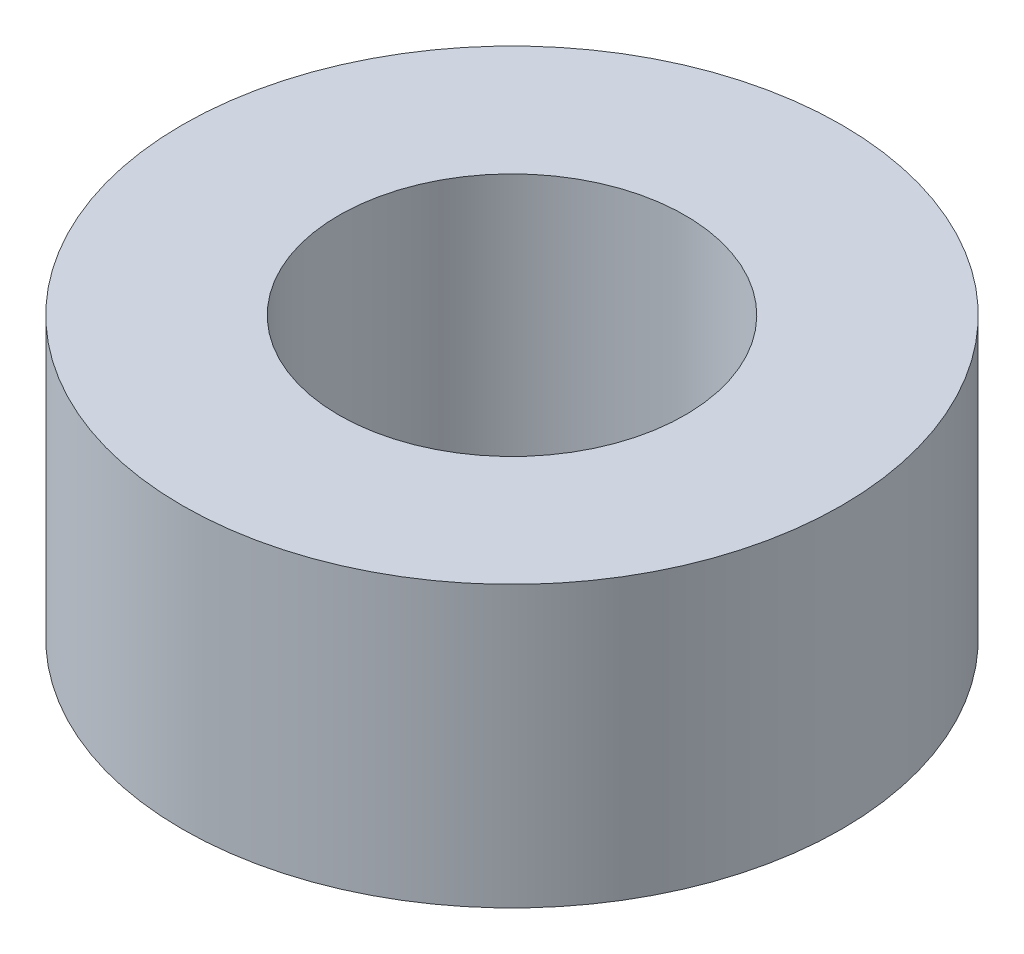
ISO-10303-21;
HEADER;
FILE_DESCRIPTION(('STEP AP214'),'2;1');
FILE_NAME('part.step','',(''),(''),'','','');
FILE_SCHEMA(('AUTOMOTIVE_DESIGN { 1 0 10303 214 1 1 1 1 }'));
ENDSEC;
DATA;
#1=APPLICATION_CONTEXT('core data for automotive mechanical design processes');
#2=APPLICATION_PROTOCOL_DEFINITION('international standard','automotive_design',2000,#1);
#3=PRODUCT_CONTEXT('',#1,'mechanical');
#4=PRODUCT('Part','Part','',(#3));
#5=PRODUCT_RELATED_PRODUCT_CATEGORY('part','',(#4));
#6=PRODUCT_DEFINITION_FORMATION('','',#4);
#7=PRODUCT_DEFINITION_CONTEXT('part definition',#1,'design');
#8=PRODUCT_DEFINITION('design','',#6,#7);
#9=PRODUCT_DEFINITION_SHAPE('','',#8);
#10=(LENGTH_UNIT() NAMED_UNIT(*) SI_UNIT(.MILLI.,.METRE.));
#11=(NAMED_UNIT(*) PLANE_ANGLE_UNIT() SI_UNIT($,.RADIAN.));
#12=(NAMED_UNIT(*) SI_UNIT($,.STERADIAN.) SOLID_ANGLE_UNIT());
#13=UNCERTAINTY_MEASURE_WITH_UNIT(LENGTH_MEASURE(1.E-05),#10,'distance_accuracy_value','');
#14=(GEOMETRIC_REPRESENTATION_CONTEXT(3) GLOBAL_UNCERTAINTY_ASSIGNED_CONTEXT((#13)) GLOBAL_UNIT_ASSIGNED_CONTEXT((#10,
#11,#12)) REPRESENTATION_CONTEXT('',''));
#15=CARTESIAN_POINT('',(0.,0.,0.));
#16=DIRECTION('',(0.,0.,1.));
#17=DIRECTION('',(1.,0.,0.));
#18=AXIS2_PLACEMENT_3D('',#15,#16,#17);
#19=CARTESIAN_POINT('',(0.,10.795,0.));
#20=DIRECTION('',(0.,-1.,0.));
#21=DIRECTION('',(0.,0.,-1.));
#22=AXIS2_PLACEMENT_3D('',#19,#20,#21);
#23=CYLINDRICAL_SURFACE('',#22,12.7);
#24=CARTESIAN_POINT('',(0.,10.795,0.));
#25=DIRECTION('',(0.,1.,0.));
#26=DIRECTION('',(0.,0.,1.));
#27=AXIS2_PLACEMENT_3D('',#24,#25,#26);
#28=CIRCLE('',#27,12.7);
#29=CARTESIAN_POINT('',(0.,10.795,12.7));
#30=VERTEX_POINT('',#29);
#31=EDGE_CURVE('E10',#30,#30,#28,.T.);
#32=ORIENTED_EDGE('',*,*,#31,.F.);
#33=EDGE_LOOP('',(#32));
#34=FACE_BOUND('',#33,.T.);
#35=CARTESIAN_POINT('',(0.,0.,0.));
#36=DIRECTION('',(0.,1.,0.));
#37=DIRECTION('',(0.,0.,1.));
#38=AXIS2_PLACEMENT_3D('',#35,#36,#37);
#39=CIRCLE('',#38,12.7);
#40=CARTESIAN_POINT('',(0.,0.,12.7));
#41=VERTEX_POINT('',#40);
#42=EDGE_CURVE('E34',#41,#41,#39,.T.);
#43=ORIENTED_EDGE('',*,*,#42,.T.);
#44=EDGE_LOOP('',(#43));
#45=FACE_BOUND('',#44,.T.);
#46=ADVANCED_FACE('F31',(#34,#45),#23,.T.);
#47=CARTESIAN_POINT('',(0.,10.795,0.));
#48=DIRECTION('',(0.,1.,0.));
#49=DIRECTION('',(0.,0.,1.));
#50=AXIS2_PLACEMENT_3D('',#47,#48,#49);
#51=PLANE('',#50);
#52=CARTESIAN_POINT('',(0.,10.795,0.));
#53=DIRECTION('',(0.,1.,0.));
#54=DIRECTION('',(0.,0.,1.));
#55=AXIS2_PLACEMENT_3D('',#52,#53,#54);
#56=CIRCLE('',#55,6.6675);
#57=CARTESIAN_POINT('',(0.,10.795,6.6675));
#58=VERTEX_POINT('',#57);
#59=EDGE_CURVE('E43',#58,#58,#56,.T.);
#60=ORIENTED_EDGE('',*,*,#59,.F.);
#61=EDGE_LOOP('',(#60));
#62=FACE_BOUND('',#61,.T.);
#63=ORIENTED_EDGE('',*,*,#31,.T.);
#64=EDGE_LOOP('',(#63));
#65=FACE_BOUND('',#64,.T.);
#66=ADVANCED_FACE('F58',(#62,#65),#51,.T.);
#67=CARTESIAN_POINT('',(0.,0.,0.));
#68=DIRECTION('',(0.,1.,0.));
#69=DIRECTION('',(0.,0.,1.));
#70=AXIS2_PLACEMENT_3D('',#67,#68,#69);
#71=PLANE('',#70);
#72=CARTESIAN_POINT('',(0.,0.,0.));
#73=DIRECTION('',(0.,1.,0.));
#74=DIRECTION('',(0.,0.,1.));
#75=AXIS2_PLACEMENT_3D('',#72,#73,#74);
#76=CIRCLE('',#75,6.6675);
#77=CARTESIAN_POINT('',(0.,0.,6.6675));
#78=VERTEX_POINT('',#77);
#79=EDGE_CURVE('E41',#78,#78,#76,.T.);
#80=ORIENTED_EDGE('',*,*,#79,.T.);
#81=EDGE_LOOP('',(#80));
#82=FACE_BOUND('',#81,.T.);
#83=ORIENTED_EDGE('',*,*,#42,.F.);
#84=EDGE_LOOP('',(#83));
#85=FACE_BOUND('',#84,.T.);
#86=ADVANCED_FACE('F49',(#82,#85),#71,.F.);
#87=CARTESIAN_POINT('',(0.,0.,0.));
#88=DIRECTION('',(0.,1.,0.));
#89=DIRECTION('',(0.,0.,1.));
#90=AXIS2_PLACEMENT_3D('',#87,#88,#89);
#91=CYLINDRICAL_SURFACE('',#90,6.6675);
#92=ORIENTED_EDGE('',*,*,#79,.F.);
#93=EDGE_LOOP('',(#92));
#94=FACE_BOUND('',#93,.T.);
#95=ORIENTED_EDGE('',*,*,#59,.T.);
#96=EDGE_LOOP('',(#95));
#97=FACE_BOUND('',#96,.T.);
#98=ADVANCED_FACE('F52',(#94,#97),#91,.F.);
#99=CLOSED_SHELL('',(#46,#66,#86,#98));
#100=MANIFOLD_SOLID_BREP('B2',#99);
#101=ADVANCED_BREP_SHAPE_REPRESENTATION('',(#18,#100),#14);
#102=SHAPE_DEFINITION_REPRESENTATION(#9,#101);
ENDSEC;
END-ISO-10303-21;
